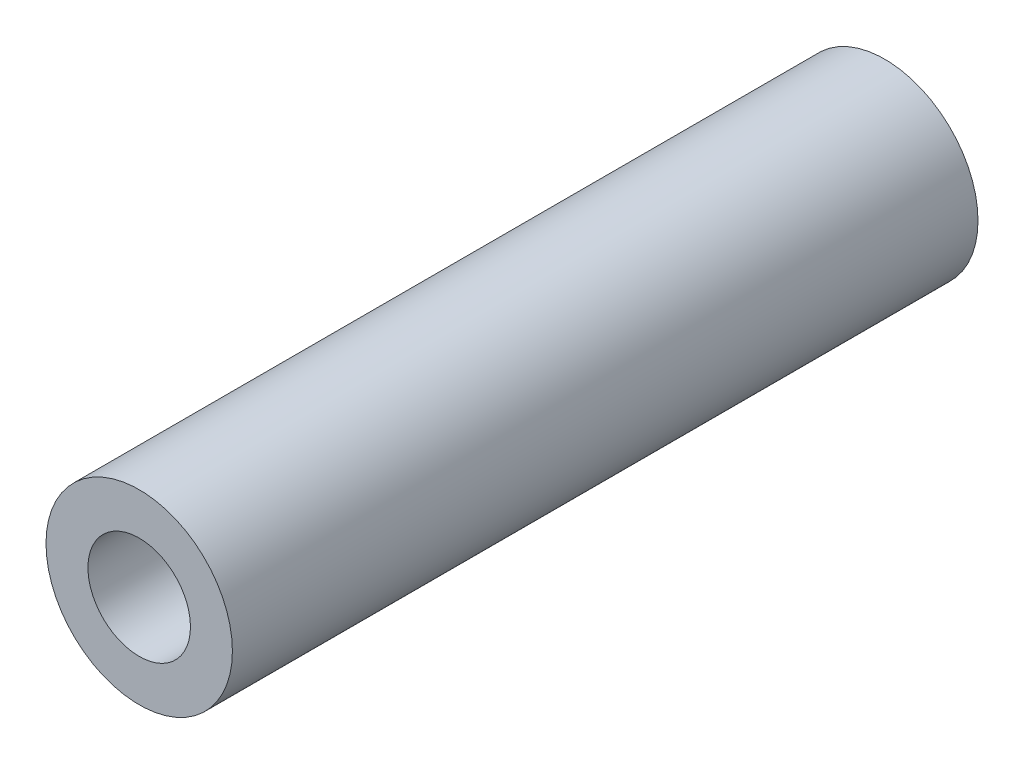
ISO-10303-21;
HEADER;
FILE_DESCRIPTION(('STEP AP214'),'2;1');
FILE_NAME('part.step','',(''),(''),'','','');
FILE_SCHEMA(('AUTOMOTIVE_DESIGN { 1 0 10303 214 1 1 1 1 }'));
ENDSEC;
DATA;
#1=APPLICATION_CONTEXT('core data for automotive mechanical design processes');
#2=APPLICATION_PROTOCOL_DEFINITION('international standard','automotive_design',2000,#1);
#3=PRODUCT_CONTEXT('',#1,'mechanical');
#4=PRODUCT('Part','Part','',(#3));
#5=PRODUCT_RELATED_PRODUCT_CATEGORY('part','',(#4));
#6=PRODUCT_DEFINITION_FORMATION('','',#4);
#7=PRODUCT_DEFINITION_CONTEXT('part definition',#1,'design');
#8=PRODUCT_DEFINITION('design','',#6,#7);
#9=PRODUCT_DEFINITION_SHAPE('','',#8);
#10=(LENGTH_UNIT() NAMED_UNIT(*) SI_UNIT(.MILLI.,.METRE.));
#11=(NAMED_UNIT(*) PLANE_ANGLE_UNIT() SI_UNIT($,.RADIAN.));
#12=(NAMED_UNIT(*) SI_UNIT($,.STERADIAN.) SOLID_ANGLE_UNIT());
#13=UNCERTAINTY_MEASURE_WITH_UNIT(LENGTH_MEASURE(1.E-05),#10,'distance_accuracy_value','');
#14=(GEOMETRIC_REPRESENTATION_CONTEXT(3) GLOBAL_UNCERTAINTY_ASSIGNED_CONTEXT((#13)) GLOBAL_UNIT_ASSIGNED_CONTEXT((#10,
#11,#12)) REPRESENTATION_CONTEXT('',''));
#15=CARTESIAN_POINT('',(0.,0.,0.));
#16=DIRECTION('',(0.,0.,1.));
#17=DIRECTION('',(1.,0.,0.));
#18=AXIS2_PLACEMENT_3D('',#15,#16,#17);
#19=CARTESIAN_POINT('',(0.,0.,120.));
#20=DIRECTION('',(0.,0.,-1.));
#21=DIRECTION('',(-1.,0.,0.));
#22=AXIS2_PLACEMENT_3D('',#19,#20,#21);
#23=PLANE('',#22);
#24=CARTESIAN_POINT('',(0.,0.,120.));
#25=DIRECTION('',(0.,0.,1.));
#26=DIRECTION('',(1.,0.,0.));
#27=AXIS2_PLACEMENT_3D('',#24,#25,#26);
#28=CIRCLE('',#27,15.);
#29=CARTESIAN_POINT('',(15.,0.,120.));
#30=VERTEX_POINT('',#29);
#31=EDGE_CURVE('E10',#30,#30,#28,.T.);
#32=ORIENTED_EDGE('',*,*,#31,.T.);
#33=EDGE_LOOP('',(#32));
#34=FACE_BOUND('',#33,.T.);
#35=CARTESIAN_POINT('',(0.,0.,120.));
#36=DIRECTION('',(0.,0.,1.));
#37=DIRECTION('',(1.,0.,0.));
#38=AXIS2_PLACEMENT_3D('',#35,#36,#37);
#39=CIRCLE('',#38,8.25);
#40=CARTESIAN_POINT('',(8.25,0.,120.));
#41=VERTEX_POINT('',#40);
#42=EDGE_CURVE('E43',#41,#41,#39,.T.);
#43=ORIENTED_EDGE('',*,*,#42,.F.);
#44=EDGE_LOOP('',(#43));
#45=FACE_BOUND('',#44,.T.);
#46=ADVANCED_FACE('F33',(#34,#45),#23,.F.);
#47=CARTESIAN_POINT('',(0.,15.,0.));
#48=DIRECTION('',(0.,0.,1.));
#49=DIRECTION('',(1.,0.,0.));
#50=AXIS2_PLACEMENT_3D('',#47,#48,#49);
#51=PLANE('',#50);
#52=CARTESIAN_POINT('',(0.,0.,0.));
#53=DIRECTION('',(0.,0.,1.));
#54=DIRECTION('',(1.,0.,0.));
#55=AXIS2_PLACEMENT_3D('',#52,#53,#54);
#56=CIRCLE('',#55,15.);
#57=CARTESIAN_POINT('',(15.,0.,0.));
#58=VERTEX_POINT('',#57);
#59=EDGE_CURVE('E39',#58,#58,#56,.T.);
#60=ORIENTED_EDGE('',*,*,#59,.F.);
#61=EDGE_LOOP('',(#60));
#62=FACE_BOUND('',#61,.T.);
#63=CARTESIAN_POINT('',(0.,0.,0.));
#64=DIRECTION('',(0.,0.,1.));
#65=DIRECTION('',(1.,0.,0.));
#66=AXIS2_PLACEMENT_3D('',#63,#64,#65);
#67=CIRCLE('',#66,8.25);
#68=CARTESIAN_POINT('',(8.25,0.,0.));
#69=VERTEX_POINT('',#68);
#70=EDGE_CURVE('E47',#69,#69,#67,.T.);
#71=ORIENTED_EDGE('',*,*,#70,.T.);
#72=EDGE_LOOP('',(#71));
#73=FACE_BOUND('',#72,.T.);
#74=ADVANCED_FACE('F53',(#62,#73),#51,.F.);
#75=CARTESIAN_POINT('',(0.,0.,0.));
#76=DIRECTION('',(0.,0.,1.));
#77=DIRECTION('',(1.,0.,0.));
#78=AXIS2_PLACEMENT_3D('',#75,#76,#77);
#79=CYLINDRICAL_SURFACE('',#78,15.);
#80=ORIENTED_EDGE('',*,*,#31,.F.);
#81=EDGE_LOOP('',(#80));
#82=FACE_BOUND('',#81,.T.);
#83=ORIENTED_EDGE('',*,*,#59,.T.);
#84=EDGE_LOOP('',(#83));
#85=FACE_BOUND('',#84,.T.);
#86=ADVANCED_FACE('F57',(#82,#85),#79,.T.);
#87=CARTESIAN_POINT('',(0.,0.,0.));
#88=DIRECTION('',(0.,0.,1.));
#89=DIRECTION('',(1.,0.,0.));
#90=AXIS2_PLACEMENT_3D('',#87,#88,#89);
#91=CYLINDRICAL_SURFACE('',#90,8.25);
#92=ORIENTED_EDGE('',*,*,#42,.T.);
#93=EDGE_LOOP('',(#92));
#94=FACE_BOUND('',#93,.T.);
#95=ORIENTED_EDGE('',*,*,#70,.F.);
#96=EDGE_LOOP('',(#95));
#97=FACE_BOUND('',#96,.T.);
#98=ADVANCED_FACE('F55',(#94,#97),#91,.F.);
#99=CLOSED_SHELL('',(#46,#74,#86,#98));
#100=MANIFOLD_SOLID_BREP('B2',#99);
#101=ADVANCED_BREP_SHAPE_REPRESENTATION('',(#18,#100),#14);
#102=SHAPE_DEFINITION_REPRESENTATION(#9,#101);
ENDSEC;
END-ISO-10303-21;
